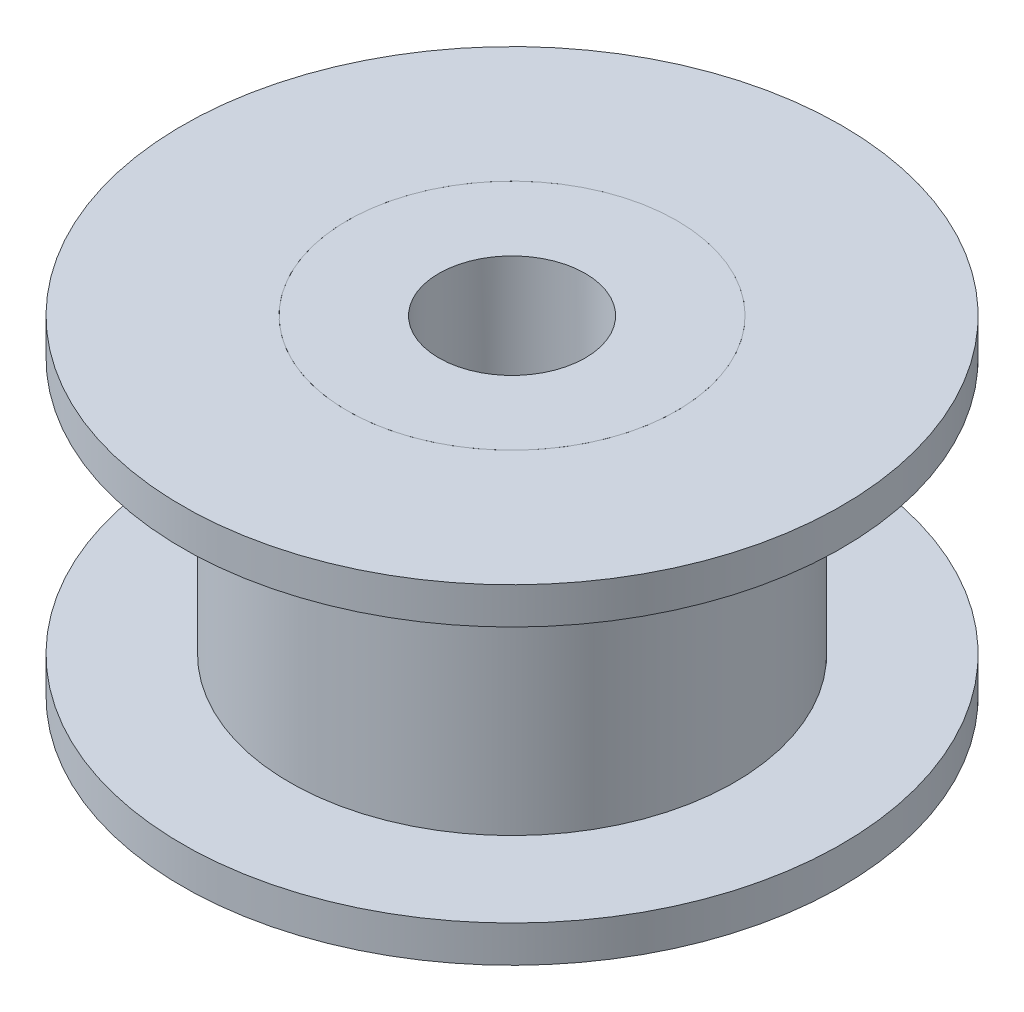
ISO-10303-21;
HEADER;
FILE_DESCRIPTION(('STEP AP214'),'2;1');
FILE_NAME('part.step','',(''),(''),'','','');
FILE_SCHEMA(('AUTOMOTIVE_DESIGN { 1 0 10303 214 1 1 1 1 }'));
ENDSEC;
DATA;
#1=APPLICATION_CONTEXT('core data for automotive mechanical design processes');
#2=APPLICATION_PROTOCOL_DEFINITION('international standard','automotive_design',2000,#1);
#3=PRODUCT_CONTEXT('',#1,'mechanical');
#4=PRODUCT('Part','Part','',(#3));
#5=PRODUCT_RELATED_PRODUCT_CATEGORY('part','',(#4));
#6=PRODUCT_DEFINITION_FORMATION('','',#4);
#7=PRODUCT_DEFINITION_CONTEXT('part definition',#1,'design');
#8=PRODUCT_DEFINITION('design','',#6,#7);
#9=PRODUCT_DEFINITION_SHAPE('','',#8);
#10=(LENGTH_UNIT() NAMED_UNIT(*) SI_UNIT(.MILLI.,.METRE.));
#11=(NAMED_UNIT(*) PLANE_ANGLE_UNIT() SI_UNIT($,.RADIAN.));
#12=(NAMED_UNIT(*) SI_UNIT($,.STERADIAN.) SOLID_ANGLE_UNIT());
#13=UNCERTAINTY_MEASURE_WITH_UNIT(LENGTH_MEASURE(1.E-05),#10,'distance_accuracy_value','');
#14=(GEOMETRIC_REPRESENTATION_CONTEXT(3) GLOBAL_UNCERTAINTY_ASSIGNED_CONTEXT((#13)) GLOBAL_UNIT_ASSIGNED_CONTEXT((#10,
#11,#12)) REPRESENTATION_CONTEXT('',''));
#15=CARTESIAN_POINT('',(0.,0.,0.));
#16=DIRECTION('',(0.,0.,1.));
#17=DIRECTION('',(1.,0.,0.));
#18=AXIS2_PLACEMENT_3D('',#15,#16,#17);
#19=CARTESIAN_POINT('',(0.,17.2279220613579,0.));
#20=DIRECTION('',(0.,-1.,0.));
#21=DIRECTION('',(0.,0.,1.));
#22=AXIS2_PLACEMENT_3D('',#19,#20,#21);
#23=CYLINDRICAL_SURFACE('',#22,4.5);
#24=CARTESIAN_POINT('',(0.,1.5,0.));
#25=DIRECTION('',(0.,1.,0.));
#26=DIRECTION('',(0.,0.,1.));
#27=AXIS2_PLACEMENT_3D('',#24,#25,#26);
#28=CIRCLE('',#27,4.5);
#29=CARTESIAN_POINT('',(0.,1.5,4.5));
#30=VERTEX_POINT('',#29);
#31=EDGE_CURVE('E47',#30,#30,#28,.T.);
#32=ORIENTED_EDGE('',*,*,#31,.T.);
#33=EDGE_LOOP('',(#32));
#34=FACE_BOUND('',#33,.T.);
#35=CARTESIAN_POINT('',(0.,4.5,0.));
#36=DIRECTION('',(0.,-1.,0.));
#37=DIRECTION('',(0.,0.,-1.));
#38=AXIS2_PLACEMENT_3D('',#35,#36,#37);
#39=CIRCLE('',#38,4.5);
#40=CARTESIAN_POINT('',(0.,4.5,-4.5));
#41=VERTEX_POINT('',#40);
#42=EDGE_CURVE('E56',#41,#41,#39,.F.);
#43=ORIENTED_EDGE('',*,*,#42,.F.);
#44=EDGE_LOOP('',(#43));
#45=FACE_BOUND('',#44,.T.);
#46=ADVANCED_FACE('F40',(#34,#45),#23,.T.);
#47=CARTESIAN_POINT('',(0.,17.2279220613579,0.));
#48=DIRECTION('',(0.,-1.,0.));
#49=DIRECTION('',(0.,0.,1.));
#50=AXIS2_PLACEMENT_3D('',#47,#48,#49);
#51=CYLINDRICAL_SURFACE('',#50,2.);
#52=CARTESIAN_POINT('',(0.,1.5,0.));
#53=DIRECTION('',(0.,1.,0.));
#54=DIRECTION('',(0.,0.,1.));
#55=AXIS2_PLACEMENT_3D('',#52,#53,#54);
#56=CIRCLE('',#55,2.);
#57=CARTESIAN_POINT('',(0.,1.5,2.));
#58=VERTEX_POINT('',#57);
#59=EDGE_CURVE('E51',#58,#58,#56,.T.);
#60=ORIENTED_EDGE('',*,*,#59,.F.);
#61=EDGE_LOOP('',(#60));
#62=FACE_BOUND('',#61,.T.);
#63=CARTESIAN_POINT('',(0.,4.5,0.));
#64=DIRECTION('',(0.,-1.,0.));
#65=DIRECTION('',(0.,0.,-1.));
#66=AXIS2_PLACEMENT_3D('',#63,#64,#65);
#67=CIRCLE('',#66,2.);
#68=CARTESIAN_POINT('',(0.,4.5,-2.));
#69=VERTEX_POINT('',#68);
#70=EDGE_CURVE('E11',#69,#69,#67,.F.);
#71=ORIENTED_EDGE('',*,*,#70,.T.);
#72=EDGE_LOOP('',(#71));
#73=FACE_BOUND('',#72,.T.);
#74=ADVANCED_FACE('F64',(#62,#73),#51,.F.);
#75=CARTESIAN_POINT('',(0.,1.5,0.));
#76=DIRECTION('',(0.,-1.,0.));
#77=DIRECTION('',(0.,0.,1.));
#78=AXIS2_PLACEMENT_3D('',#75,#76,#77);
#79=PLANE('',#78);
#80=ORIENTED_EDGE('',*,*,#59,.T.);
#81=EDGE_LOOP('',(#80));
#82=FACE_BOUND('',#81,.T.);
#83=ORIENTED_EDGE('',*,*,#31,.F.);
#84=EDGE_LOOP('',(#83));
#85=FACE_BOUND('',#84,.T.);
#86=ADVANCED_FACE('F69',(#82,#85),#79,.T.);
#87=CARTESIAN_POINT('',(4.5,4.5,0.));
#88=DIRECTION('',(0.,1.,0.));
#89=DIRECTION('',(0.,0.,-1.));
#90=AXIS2_PLACEMENT_3D('',#87,#88,#89);
#91=PLANE('',#90);
#92=ORIENTED_EDGE('',*,*,#42,.T.);
#93=EDGE_LOOP('',(#92));
#94=FACE_BOUND('',#93,.T.);
#95=ORIENTED_EDGE('',*,*,#70,.F.);
#96=EDGE_LOOP('',(#95));
#97=FACE_BOUND('',#96,.T.);
#98=ADVANCED_FACE('F42',(#94,#97),#91,.T.);
#99=CLOSED_SHELL('',(#46,#74,#86,#98));
#100=MANIFOLD_SOLID_BREP('B2',#99);
#101=CARTESIAN_POINT('',(0.,-17.2279220613579,0.));
#102=DIRECTION('',(0.,1.,0.));
#103=DIRECTION('',(0.,0.,1.));
#104=AXIS2_PLACEMENT_3D('',#101,#102,#103);
#105=CYLINDRICAL_SURFACE('',#104,4.5);
#106=CARTESIAN_POINT('',(0.,-1.5,0.));
#107=DIRECTION('',(0.,1.,0.));
#108=DIRECTION('',(0.,0.,1.));
#109=AXIS2_PLACEMENT_3D('',#106,#107,#108);
#110=CIRCLE('',#109,4.5);
#111=CARTESIAN_POINT('',(0.,-1.5,4.5));
#112=VERTEX_POINT('',#111);
#113=EDGE_CURVE('E116',#112,#112,#110,.T.);
#114=ORIENTED_EDGE('',*,*,#113,.F.);
#115=EDGE_LOOP('',(#114));
#116=FACE_BOUND('',#115,.T.);
#117=CARTESIAN_POINT('',(0.,-4.5,0.));
#118=DIRECTION('',(0.,-1.,0.));
#119=DIRECTION('',(0.,0.,-1.));
#120=AXIS2_PLACEMENT_3D('',#117,#118,#119);
#121=CIRCLE('',#120,4.5);
#122=CARTESIAN_POINT('',(0.,-4.5,-4.5));
#123=VERTEX_POINT('',#122);
#124=EDGE_CURVE('E125',#123,#123,#121,.F.);
#125=ORIENTED_EDGE('',*,*,#124,.T.);
#126=EDGE_LOOP('',(#125));
#127=FACE_BOUND('',#126,.T.);
#128=ADVANCED_FACE('F109',(#116,#127),#105,.T.);
#129=CARTESIAN_POINT('',(0.,-17.2279220613579,0.));
#130=DIRECTION('',(0.,1.,0.));
#131=DIRECTION('',(0.,0.,1.));
#132=AXIS2_PLACEMENT_3D('',#129,#130,#131);
#133=CYLINDRICAL_SURFACE('',#132,2.);
#134=CARTESIAN_POINT('',(0.,-1.5,0.));
#135=DIRECTION('',(0.,1.,0.));
#136=DIRECTION('',(0.,0.,1.));
#137=AXIS2_PLACEMENT_3D('',#134,#135,#136);
#138=CIRCLE('',#137,2.);
#139=CARTESIAN_POINT('',(0.,-1.5,2.));
#140=VERTEX_POINT('',#139);
#141=EDGE_CURVE('E120',#140,#140,#138,.T.);
#142=ORIENTED_EDGE('',*,*,#141,.T.);
#143=EDGE_LOOP('',(#142));
#144=FACE_BOUND('',#143,.T.);
#145=CARTESIAN_POINT('',(0.,-4.5,0.));
#146=DIRECTION('',(0.,-1.,0.));
#147=DIRECTION('',(0.,0.,-1.));
#148=AXIS2_PLACEMENT_3D('',#145,#146,#147);
#149=CIRCLE('',#148,2.);
#150=CARTESIAN_POINT('',(0.,-4.5,-2.));
#151=VERTEX_POINT('',#150);
#152=EDGE_CURVE('E39',#151,#151,#149,.F.);
#153=ORIENTED_EDGE('',*,*,#152,.F.);
#154=EDGE_LOOP('',(#153));
#155=FACE_BOUND('',#154,.T.);
#156=ADVANCED_FACE('F136',(#144,#155),#133,.F.);
#157=CARTESIAN_POINT('',(0.,-1.5,0.));
#158=DIRECTION('',(0.,1.,0.));
#159=DIRECTION('',(0.,0.,1.));
#160=AXIS2_PLACEMENT_3D('',#157,#158,#159);
#161=PLANE('',#160);
#162=ORIENTED_EDGE('',*,*,#141,.F.);
#163=EDGE_LOOP('',(#162));
#164=FACE_BOUND('',#163,.T.);
#165=ORIENTED_EDGE('',*,*,#113,.T.);
#166=EDGE_LOOP('',(#165));
#167=FACE_BOUND('',#166,.T.);
#168=ADVANCED_FACE('F132',(#164,#167),#161,.T.);
#169=CARTESIAN_POINT('',(4.5,-4.5,0.));
#170=DIRECTION('',(0.,-1.,0.));
#171=DIRECTION('',(0.,0.,-1.));
#172=AXIS2_PLACEMENT_3D('',#169,#170,#171);
#173=PLANE('',#172);
#174=ORIENTED_EDGE('',*,*,#124,.F.);
#175=EDGE_LOOP('',(#174));
#176=FACE_BOUND('',#175,.T.);
#177=ORIENTED_EDGE('',*,*,#152,.T.);
#178=EDGE_LOOP('',(#177));
#179=FACE_BOUND('',#178,.T.);
#180=ADVANCED_FACE('F111',(#176,#179),#173,.T.);
#181=CLOSED_SHELL('',(#128,#156,#168,#180));
#182=MANIFOLD_SOLID_BREP('B6',#181);
#183=CARTESIAN_POINT('',(0.,0.,0.));
#184=DIRECTION('',(0.,-1.,0.));
#185=DIRECTION('',(0.,0.,-1.));
#186=AXIS2_PLACEMENT_3D('',#183,#184,#185);
#187=CYLINDRICAL_SURFACE('',#186,2.5);
#188=CARTESIAN_POINT('',(0.,-1.5,0.));
#189=DIRECTION('',(0.,-1.,0.));
#190=DIRECTION('',(0.,0.,-1.));
#191=AXIS2_PLACEMENT_3D('',#188,#189,#190);
#192=CIRCLE('',#191,2.5);
#193=CARTESIAN_POINT('',(0.,-1.5,-2.5));
#194=VERTEX_POINT('',#193);
#195=EDGE_CURVE('E108',#194,#194,#192,.T.);
#196=ORIENTED_EDGE('',*,*,#195,.T.);
#197=EDGE_LOOP('',(#196));
#198=FACE_BOUND('',#197,.T.);
#199=CARTESIAN_POINT('',(0.,1.5,0.));
#200=DIRECTION('',(0.,-1.,0.));
#201=DIRECTION('',(0.,0.,-1.));
#202=AXIS2_PLACEMENT_3D('',#199,#200,#201);
#203=CIRCLE('',#202,2.5);
#204=CARTESIAN_POINT('',(0.,1.5,-2.5));
#205=VERTEX_POINT('',#204);
#206=EDGE_CURVE('E211',#205,#205,#203,.T.);
#207=ORIENTED_EDGE('',*,*,#206,.F.);
#208=EDGE_LOOP('',(#207));
#209=FACE_BOUND('',#208,.T.);
#210=ADVANCED_FACE('F171',(#198,#209),#187,.F.);
#211=CARTESIAN_POINT('',(2.5,-1.5,0.));
#212=DIRECTION('',(0.,-1.,0.));
#213=DIRECTION('',(0.,0.,-1.));
#214=AXIS2_PLACEMENT_3D('',#211,#212,#213);
#215=PLANE('',#214);
#216=CARTESIAN_POINT('',(0.,-1.5,0.));
#217=DIRECTION('',(0.,-1.,0.));
#218=DIRECTION('',(0.,0.,-1.));
#219=AXIS2_PLACEMENT_3D('',#216,#217,#218);
#220=CIRCLE('',#219,4.5);
#221=CARTESIAN_POINT('',(0.,-1.5,-4.5));
#222=VERTEX_POINT('',#221);
#223=EDGE_CURVE('E177',#222,#222,#220,.T.);
#224=ORIENTED_EDGE('',*,*,#223,.T.);
#225=EDGE_LOOP('',(#224));
#226=FACE_BOUND('',#225,.T.);
#227=ORIENTED_EDGE('',*,*,#195,.F.);
#228=EDGE_LOOP('',(#227));
#229=FACE_BOUND('',#228,.T.);
#230=ADVANCED_FACE('F219',(#226,#229),#215,.T.);
#231=CARTESIAN_POINT('',(0.,0.,0.));
#232=DIRECTION('',(0.,-1.,0.));
#233=DIRECTION('',(0.,0.,-1.));
#234=AXIS2_PLACEMENT_3D('',#231,#232,#233);
#235=CYLINDRICAL_SURFACE('',#234,4.5);
#236=CARTESIAN_POINT('',(0.,-4.5,0.));
#237=DIRECTION('',(0.,-1.,0.));
#238=DIRECTION('',(0.,0.,-1.));
#239=AXIS2_PLACEMENT_3D('',#236,#237,#238);
#240=CIRCLE('',#239,4.5);
#241=CARTESIAN_POINT('',(0.,-4.5,-4.5));
#242=VERTEX_POINT('',#241);
#243=EDGE_CURVE('E181',#242,#242,#240,.T.);
#244=ORIENTED_EDGE('',*,*,#243,.T.);
#245=EDGE_LOOP('',(#244));
#246=FACE_BOUND('',#245,.T.);
#247=ORIENTED_EDGE('',*,*,#223,.F.);
#248=EDGE_LOOP('',(#247));
#249=FACE_BOUND('',#248,.T.);
#250=ADVANCED_FACE('F223',(#246,#249),#235,.F.);
#251=CARTESIAN_POINT('',(4.5,-4.5,0.));
#252=DIRECTION('',(0.,-1.,0.));
#253=DIRECTION('',(0.,0.,-1.));
#254=AXIS2_PLACEMENT_3D('',#251,#252,#253);
#255=PLANE('',#254);
#256=CARTESIAN_POINT('',(0.,-4.5,0.));
#257=DIRECTION('',(0.,-1.,0.));
#258=DIRECTION('',(0.,0.,-1.));
#259=AXIS2_PLACEMENT_3D('',#256,#257,#258);
#260=CIRCLE('',#259,9.);
#261=CARTESIAN_POINT('',(0.,-4.5,-9.));
#262=VERTEX_POINT('',#261);
#263=EDGE_CURVE('E185',#262,#262,#260,.T.);
#264=ORIENTED_EDGE('',*,*,#263,.T.);
#265=EDGE_LOOP('',(#264));
#266=FACE_BOUND('',#265,.T.);
#267=ORIENTED_EDGE('',*,*,#243,.F.);
#268=EDGE_LOOP('',(#267));
#269=FACE_BOUND('',#268,.T.);
#270=ADVANCED_FACE('F227',(#266,#269),#255,.T.);
#271=CARTESIAN_POINT('',(0.,0.,0.));
#272=DIRECTION('',(0.,-1.,0.));
#273=DIRECTION('',(0.,0.,-1.));
#274=AXIS2_PLACEMENT_3D('',#271,#272,#273);
#275=CYLINDRICAL_SURFACE('',#274,9.);
#276=CARTESIAN_POINT('',(0.,-3.5,0.));
#277=DIRECTION('',(0.,-1.,0.));
#278=DIRECTION('',(0.,0.,-1.));
#279=AXIS2_PLACEMENT_3D('',#276,#277,#278);
#280=CIRCLE('',#279,9.);
#281=CARTESIAN_POINT('',(0.,-3.5,-9.));
#282=VERTEX_POINT('',#281);
#283=EDGE_CURVE('E190',#282,#282,#280,.T.);
#284=ORIENTED_EDGE('',*,*,#283,.T.);
#285=EDGE_LOOP('',(#284));
#286=FACE_BOUND('',#285,.T.);
#287=ORIENTED_EDGE('',*,*,#263,.F.);
#288=EDGE_LOOP('',(#287));
#289=FACE_BOUND('',#288,.T.);
#290=ADVANCED_FACE('F234',(#286,#289),#275,.T.);
#291=CARTESIAN_POINT('',(9.,-3.5,0.));
#292=DIRECTION('',(0.,1.,0.));
#293=DIRECTION('',(0.,0.,1.));
#294=AXIS2_PLACEMENT_3D('',#291,#292,#293);
#295=PLANE('',#294);
#296=CARTESIAN_POINT('',(0.,-3.5,0.));
#297=DIRECTION('',(0.,-1.,0.));
#298=DIRECTION('',(0.,0.,-1.));
#299=AXIS2_PLACEMENT_3D('',#296,#297,#298);
#300=CIRCLE('',#299,6.075);
#301=CARTESIAN_POINT('',(0.,-3.5,-6.075));
#302=VERTEX_POINT('',#301);
#303=EDGE_CURVE('E193',#302,#302,#300,.T.);
#304=ORIENTED_EDGE('',*,*,#303,.T.);
#305=EDGE_LOOP('',(#304));
#306=FACE_BOUND('',#305,.T.);
#307=ORIENTED_EDGE('',*,*,#283,.F.);
#308=EDGE_LOOP('',(#307));
#309=FACE_BOUND('',#308,.T.);
#310=ADVANCED_FACE('F238',(#306,#309),#295,.T.);
#311=CARTESIAN_POINT('',(0.,0.,0.));
#312=DIRECTION('',(0.,-1.,0.));
#313=DIRECTION('',(0.,0.,-1.));
#314=AXIS2_PLACEMENT_3D('',#311,#312,#313);
#315=CYLINDRICAL_SURFACE('',#314,6.075);
#316=CARTESIAN_POINT('',(0.,3.5,0.));
#317=DIRECTION('',(0.,-1.,0.));
#318=DIRECTION('',(0.,0.,-1.));
#319=AXIS2_PLACEMENT_3D('',#316,#317,#318);
#320=CIRCLE('',#319,6.075);
#321=CARTESIAN_POINT('',(0.,3.5,-6.075));
#322=VERTEX_POINT('',#321);
#323=EDGE_CURVE('E196',#322,#322,#320,.T.);
#324=ORIENTED_EDGE('',*,*,#323,.T.);
#325=EDGE_LOOP('',(#324));
#326=FACE_BOUND('',#325,.T.);
#327=ORIENTED_EDGE('',*,*,#303,.F.);
#328=EDGE_LOOP('',(#327));
#329=FACE_BOUND('',#328,.T.);
#330=ADVANCED_FACE('F242',(#326,#329),#315,.T.);
#331=CARTESIAN_POINT('',(9.,3.5,0.));
#332=DIRECTION('',(0.,-1.,0.));
#333=DIRECTION('',(0.,0.,-1.));
#334=AXIS2_PLACEMENT_3D('',#331,#332,#333);
#335=PLANE('',#334);
#336=CARTESIAN_POINT('',(0.,3.5,0.));
#337=DIRECTION('',(0.,-1.,0.));
#338=DIRECTION('',(0.,0.,-1.));
#339=AXIS2_PLACEMENT_3D('',#336,#337,#338);
#340=CIRCLE('',#339,9.);
#341=CARTESIAN_POINT('',(0.,3.5,-9.));
#342=VERTEX_POINT('',#341);
#343=EDGE_CURVE('E199',#342,#342,#340,.T.);
#344=ORIENTED_EDGE('',*,*,#343,.T.);
#345=EDGE_LOOP('',(#344));
#346=FACE_BOUND('',#345,.T.);
#347=ORIENTED_EDGE('',*,*,#323,.F.);
#348=EDGE_LOOP('',(#347));
#349=FACE_BOUND('',#348,.T.);
#350=ADVANCED_FACE('F246',(#346,#349),#335,.T.);
#351=CARTESIAN_POINT('',(0.,0.,0.));
#352=DIRECTION('',(0.,-1.,0.));
#353=DIRECTION('',(0.,0.,-1.));
#354=AXIS2_PLACEMENT_3D('',#351,#352,#353);
#355=CYLINDRICAL_SURFACE('',#354,9.);
#356=CARTESIAN_POINT('',(0.,4.5,0.));
#357=DIRECTION('',(0.,-1.,0.));
#358=DIRECTION('',(0.,0.,-1.));
#359=AXIS2_PLACEMENT_3D('',#356,#357,#358);
#360=CIRCLE('',#359,9.);
#361=CARTESIAN_POINT('',(0.,4.5,-9.));
#362=VERTEX_POINT('',#361);
#363=EDGE_CURVE('E202',#362,#362,#360,.T.);
#364=ORIENTED_EDGE('',*,*,#363,.T.);
#365=EDGE_LOOP('',(#364));
#366=FACE_BOUND('',#365,.T.);
#367=ORIENTED_EDGE('',*,*,#343,.F.);
#368=EDGE_LOOP('',(#367));
#369=FACE_BOUND('',#368,.T.);
#370=ADVANCED_FACE('F250',(#366,#369),#355,.T.);
#371=CARTESIAN_POINT('',(4.5,4.5,0.));
#372=DIRECTION('',(0.,1.,0.));
#373=DIRECTION('',(0.,0.,1.));
#374=AXIS2_PLACEMENT_3D('',#371,#372,#373);
#375=PLANE('',#374);
#376=CARTESIAN_POINT('',(0.,4.5,0.));
#377=DIRECTION('',(0.,-1.,0.));
#378=DIRECTION('',(0.,0.,-1.));
#379=AXIS2_PLACEMENT_3D('',#376,#377,#378);
#380=CIRCLE('',#379,4.5);
#381=CARTESIAN_POINT('',(0.,4.5,-4.5));
#382=VERTEX_POINT('',#381);
#383=EDGE_CURVE('E205',#382,#382,#380,.T.);
#384=ORIENTED_EDGE('',*,*,#383,.T.);
#385=EDGE_LOOP('',(#384));
#386=FACE_BOUND('',#385,.T.);
#387=ORIENTED_EDGE('',*,*,#363,.F.);
#388=EDGE_LOOP('',(#387));
#389=FACE_BOUND('',#388,.T.);
#390=ADVANCED_FACE('F254',(#386,#389),#375,.T.);
#391=CARTESIAN_POINT('',(0.,0.,0.));
#392=DIRECTION('',(0.,-1.,0.));
#393=DIRECTION('',(0.,0.,-1.));
#394=AXIS2_PLACEMENT_3D('',#391,#392,#393);
#395=CYLINDRICAL_SURFACE('',#394,4.5);
#396=CARTESIAN_POINT('',(0.,1.5,0.));
#397=DIRECTION('',(0.,-1.,0.));
#398=DIRECTION('',(0.,0.,-1.));
#399=AXIS2_PLACEMENT_3D('',#396,#397,#398);
#400=CIRCLE('',#399,4.5);
#401=CARTESIAN_POINT('',(0.,1.5,-4.5));
#402=VERTEX_POINT('',#401);
#403=EDGE_CURVE('E208',#402,#402,#400,.T.);
#404=ORIENTED_EDGE('',*,*,#403,.T.);
#405=EDGE_LOOP('',(#404));
#406=FACE_BOUND('',#405,.T.);
#407=ORIENTED_EDGE('',*,*,#383,.F.);
#408=EDGE_LOOP('',(#407));
#409=FACE_BOUND('',#408,.T.);
#410=ADVANCED_FACE('F258',(#406,#409),#395,.F.);
#411=CARTESIAN_POINT('',(2.5,1.5,0.));
#412=DIRECTION('',(0.,1.,0.));
#413=DIRECTION('',(0.,0.,1.));
#414=AXIS2_PLACEMENT_3D('',#411,#412,#413);
#415=PLANE('',#414);
#416=ORIENTED_EDGE('',*,*,#206,.T.);
#417=EDGE_LOOP('',(#416));
#418=FACE_BOUND('',#417,.T.);
#419=ORIENTED_EDGE('',*,*,#403,.F.);
#420=EDGE_LOOP('',(#419));
#421=FACE_BOUND('',#420,.T.);
#422=ADVANCED_FACE('F215',(#418,#421),#415,.T.);
#423=CLOSED_SHELL('',(#210,#230,#250,#270,#290,#310,#330,#350,#370,#390,#410,#422));
#424=MANIFOLD_SOLID_BREP('B34',#423);
#425=ADVANCED_BREP_SHAPE_REPRESENTATION('',(#18,#100,#182,#424),#14);
#426=SHAPE_DEFINITION_REPRESENTATION(#9,#425);
ENDSEC;
END-ISO-10303-21;
